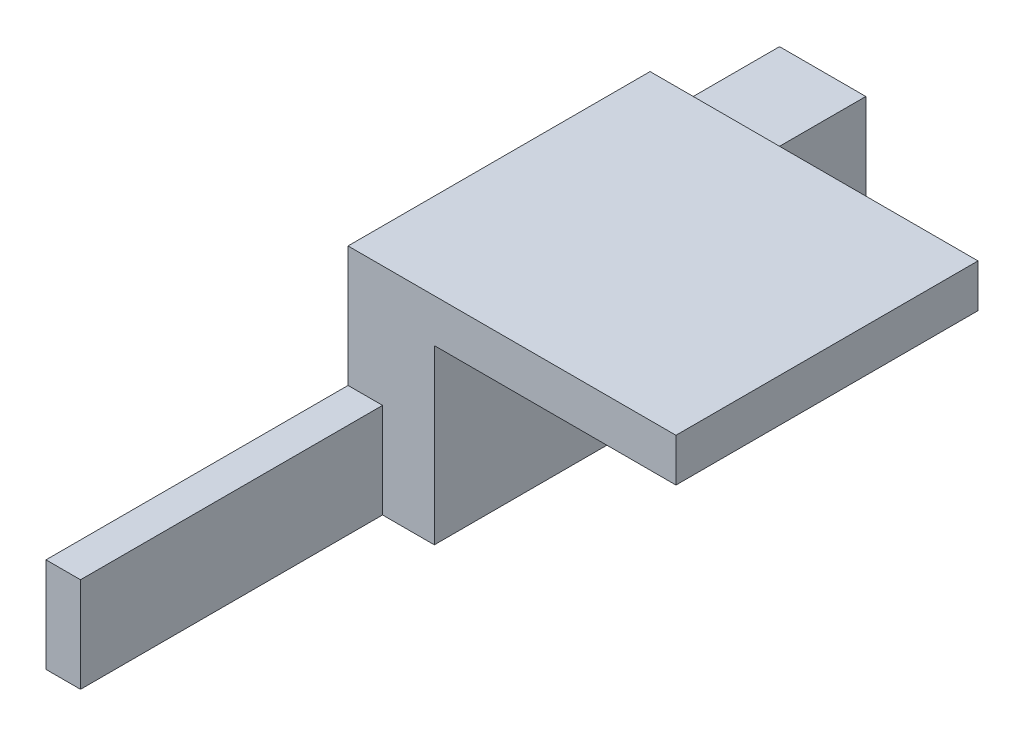
ISO-10303-21;
HEADER;
FILE_DESCRIPTION(('STEP AP214'),'2;1');
FILE_NAME('part.step','',(''),(''),'','','');
FILE_SCHEMA(('AUTOMOTIVE_DESIGN { 1 0 10303 214 1 1 1 1 }'));
ENDSEC;
DATA;
#1=APPLICATION_CONTEXT('core data for automotive mechanical design processes');
#2=APPLICATION_PROTOCOL_DEFINITION('international standard','automotive_design',2000,#1);
#3=PRODUCT_CONTEXT('',#1,'mechanical');
#4=PRODUCT('Part','Part','',(#3));
#5=PRODUCT_RELATED_PRODUCT_CATEGORY('part','',(#4));
#6=PRODUCT_DEFINITION_FORMATION('','',#4);
#7=PRODUCT_DEFINITION_CONTEXT('part definition',#1,'design');
#8=PRODUCT_DEFINITION('design','',#6,#7);
#9=PRODUCT_DEFINITION_SHAPE('','',#8);
#10=(LENGTH_UNIT() NAMED_UNIT(*) SI_UNIT(.MILLI.,.METRE.));
#11=(NAMED_UNIT(*) PLANE_ANGLE_UNIT() SI_UNIT($,.RADIAN.));
#12=(NAMED_UNIT(*) SI_UNIT($,.STERADIAN.) SOLID_ANGLE_UNIT());
#13=UNCERTAINTY_MEASURE_WITH_UNIT(LENGTH_MEASURE(1.E-05),#10,'distance_accuracy_value','');
#14=(GEOMETRIC_REPRESENTATION_CONTEXT(3) GLOBAL_UNCERTAINTY_ASSIGNED_CONTEXT((#13)) GLOBAL_UNIT_ASSIGNED_CONTEXT((#10,
#11,#12)) REPRESENTATION_CONTEXT('',''));
#15=CARTESIAN_POINT('',(0.,0.,0.));
#16=DIRECTION('',(0.,0.,1.));
#17=DIRECTION('',(1.,0.,0.));
#18=AXIS2_PLACEMENT_3D('',#15,#16,#17);
#19=CARTESIAN_POINT('',(0.,0.,0.));
#20=DIRECTION('',(0.,-1.,0.));
#21=DIRECTION('',(0.,0.,-1.));
#22=AXIS2_PLACEMENT_3D('',#19,#20,#21);
#23=PLANE('',#22);
#24=DIRECTION('',(-1.,0.,0.));
#25=VECTOR('',#24,1.);
#26=CARTESIAN_POINT('',(38.,0.,35.));
#27=LINE('',#26,#25);
#28=CARTESIAN_POINT('',(38.,0.,35.));
#29=VERTEX_POINT('',#28);
#30=CARTESIAN_POINT('',(10.,0.,35.));
#31=VERTEX_POINT('',#30);
#32=EDGE_CURVE('E189',#29,#31,#27,.T.);
#33=ORIENTED_EDGE('',*,*,#32,.T.);
#34=DIRECTION('',(0.,0.,-1.));
#35=VECTOR('',#34,1.);
#36=CARTESIAN_POINT('',(10.,0.,35.));
#37=LINE('',#36,#35);
#38=CARTESIAN_POINT('',(10.,0.,0.));
#39=VERTEX_POINT('',#38);
#40=EDGE_CURVE('E162',#31,#39,#37,.T.);
#41=ORIENTED_EDGE('',*,*,#40,.T.);
#42=DIRECTION('',(-1.,0.,0.));
#43=VECTOR('',#42,1.);
#44=CARTESIAN_POINT('',(38.,0.,0.));
#45=LINE('',#44,#43);
#46=CARTESIAN_POINT('',(38.,0.,0.));
#47=VERTEX_POINT('',#46);
#48=EDGE_CURVE('E180',#47,#39,#45,.T.);
#49=ORIENTED_EDGE('',*,*,#48,.F.);
#50=DIRECTION('',(0.,0.,1.));
#51=VECTOR('',#50,1.);
#52=CARTESIAN_POINT('',(38.,0.,0.));
#53=LINE('',#52,#51);
#54=EDGE_CURVE('E171',#47,#29,#53,.T.);
#55=ORIENTED_EDGE('',*,*,#54,.T.);
#56=EDGE_LOOP('',(#33,#41,#49,#55));
#57=FACE_BOUND('',#56,.T.);
#58=ADVANCED_FACE('F35',(#57),#23,.T.);
#59=CARTESIAN_POINT('',(38.,5.,0.));
#60=DIRECTION('',(1.,0.,0.));
#61=DIRECTION('',(0.,0.,-1.));
#62=AXIS2_PLACEMENT_3D('',#59,#60,#61);
#63=PLANE('',#62);
#64=ORIENTED_EDGE('',*,*,#54,.F.);
#65=DIRECTION('',(0.,-1.,0.));
#66=VECTOR('',#65,1.);
#67=CARTESIAN_POINT('',(38.,5.,0.));
#68=LINE('',#67,#66);
#69=CARTESIAN_POINT('',(38.,5.,0.));
#70=VERTEX_POINT('',#69);
#71=EDGE_CURVE('E11',#70,#47,#68,.T.);
#72=ORIENTED_EDGE('',*,*,#71,.F.);
#73=DIRECTION('',(0.,0.,1.));
#74=VECTOR('',#73,1.);
#75=CARTESIAN_POINT('',(38.,5.,0.));
#76=LINE('',#75,#74);
#77=CARTESIAN_POINT('',(38.,5.,35.));
#78=VERTEX_POINT('',#77);
#79=EDGE_CURVE('E176',#70,#78,#76,.T.);
#80=ORIENTED_EDGE('',*,*,#79,.T.);
#81=DIRECTION('',(0.,-1.,0.));
#82=VECTOR('',#81,1.);
#83=CARTESIAN_POINT('',(38.,5.,35.));
#84=LINE('',#83,#82);
#85=EDGE_CURVE('E39',#78,#29,#84,.T.);
#86=ORIENTED_EDGE('',*,*,#85,.T.);
#87=EDGE_LOOP('',(#64,#72,#80,#86));
#88=FACE_BOUND('',#87,.T.);
#89=ADVANCED_FACE('F37',(#88),#63,.T.);
#90=CARTESIAN_POINT('',(38.,5.,0.));
#91=DIRECTION('',(0.,0.,1.));
#92=DIRECTION('',(1.,0.,0.));
#93=AXIS2_PLACEMENT_3D('',#90,#91,#92);
#94=PLANE('',#93);
#95=ORIENTED_EDGE('',*,*,#48,.T.);
#96=CARTESIAN_POINT('',(0.,0.,0.));
#97=VERTEX_POINT('',#96);
#98=EDGE_CURVE('E192',#39,#97,#45,.T.);
#99=ORIENTED_EDGE('',*,*,#98,.T.);
#100=DIRECTION('',(0.,-1.,0.));
#101=VECTOR('',#100,1.);
#102=CARTESIAN_POINT('',(0.,5.,0.));
#103=LINE('',#102,#101);
#104=CARTESIAN_POINT('',(0.,5.,0.));
#105=VERTEX_POINT('',#104);
#106=EDGE_CURVE('E44',#105,#97,#103,.T.);
#107=ORIENTED_EDGE('',*,*,#106,.F.);
#108=DIRECTION('',(-1.,0.,0.));
#109=VECTOR('',#108,1.);
#110=CARTESIAN_POINT('',(38.,5.,0.));
#111=LINE('',#110,#109);
#112=EDGE_CURVE('E185',#70,#105,#111,.T.);
#113=ORIENTED_EDGE('',*,*,#112,.F.);
#114=ORIENTED_EDGE('',*,*,#71,.T.);
#115=EDGE_LOOP('',(#95,#99,#107,#113,#114));
#116=FACE_BOUND('',#115,.T.);
#117=ADVANCED_FACE('F211',(#116),#94,.F.);
#118=CARTESIAN_POINT('',(0.,5.,0.));
#119=DIRECTION('',(1.,0.,0.));
#120=DIRECTION('',(0.,0.,-1.));
#121=AXIS2_PLACEMENT_3D('',#118,#119,#120);
#122=PLANE('',#121);
#123=CARTESIAN_POINT('',(0.,-14.5,51.7000000000001));
#124=DIRECTION('',(1.,0.,0.));
#125=DIRECTION('',(0.,0.,-1.));
#126=AXIS2_PLACEMENT_3D('',#123,#124,#125);
#127=CIRCLE('',#126,3.09999999999999);
#128=CARTESIAN_POINT('',(0.,-14.5,48.6000000000001));
#129=VERTEX_POINT('',#128);
#130=EDGE_CURVE('E384',#129,#129,#127,.T.);
#131=ORIENTED_EDGE('',*,*,#130,.T.);
#132=EDGE_LOOP('',(#131));
#133=FACE_BOUND('',#132,.T.);
#134=CARTESIAN_POINT('',(0.,-14.5,29.4000000000001));
#135=DIRECTION('',(1.,0.,0.));
#136=DIRECTION('',(0.,0.,-1.));
#137=AXIS2_PLACEMENT_3D('',#134,#135,#136);
#138=CIRCLE('',#137,3.1);
#139=CARTESIAN_POINT('',(0.,-14.5,26.3000000000001));
#140=VERTEX_POINT('',#139);
#141=EDGE_CURVE('E387',#140,#140,#138,.T.);
#142=ORIENTED_EDGE('',*,*,#141,.T.);
#143=EDGE_LOOP('',(#142));
#144=FACE_BOUND('',#143,.T.);
#145=ORIENTED_EDGE('',*,*,#106,.T.);
#146=DIRECTION('',(0.,0.,-1.));
#147=VECTOR('',#146,1.);
#148=CARTESIAN_POINT('',(0.,0.,35.));
#149=LINE('',#148,#147);
#150=CARTESIAN_POINT('',(0.,0.,-15.));
#151=VERTEX_POINT('',#150);
#152=EDGE_CURVE('E155',#97,#151,#149,.T.);
#153=ORIENTED_EDGE('',*,*,#152,.T.);
#154=DIRECTION('',(0.,1.,0.));
#155=VECTOR('',#154,1.);
#156=CARTESIAN_POINT('',(0.,-20.,-15.));
#157=LINE('',#156,#155);
#158=CARTESIAN_POINT('',(0.,-20.,-15.));
#159=VERTEX_POINT('',#158);
#160=EDGE_CURVE('E172',#159,#151,#157,.T.);
#161=ORIENTED_EDGE('',*,*,#160,.F.);
#162=DIRECTION('',(0.,0.,-1.));
#163=VECTOR('',#162,1.);
#164=CARTESIAN_POINT('',(0.,-20.,35.));
#165=LINE('',#164,#163);
#166=CARTESIAN_POINT('',(0.,-20.,70.));
#167=VERTEX_POINT('',#166);
#168=EDGE_CURVE('E158',#167,#159,#165,.T.);
#169=ORIENTED_EDGE('',*,*,#168,.F.);
#170=DIRECTION('',(0.,-1.,0.));
#171=VECTOR('',#170,1.);
#172=CARTESIAN_POINT('',(0.,5.,70.));
#173=LINE('',#172,#171);
#174=CARTESIAN_POINT('',(0.,-8.99999999999997,70.));
#175=VERTEX_POINT('',#174);
#176=EDGE_CURVE('E130',#175,#167,#173,.T.);
#177=ORIENTED_EDGE('',*,*,#176,.F.);
#178=DIRECTION('',(0.,0.,1.));
#179=VECTOR('',#178,1.);
#180=CARTESIAN_POINT('',(0.,-8.99999999999996,0.));
#181=LINE('',#180,#179);
#182=CARTESIAN_POINT('',(0.,-8.99999999999996,35.));
#183=VERTEX_POINT('',#182);
#184=EDGE_CURVE('E123',#183,#175,#181,.T.);
#185=ORIENTED_EDGE('',*,*,#184,.F.);
#186=DIRECTION('',(0.,-1.,0.));
#187=VECTOR('',#186,1.);
#188=CARTESIAN_POINT('',(0.,5.,35.));
#189=LINE('',#188,#187);
#190=CARTESIAN_POINT('',(0.,5.,35.));
#191=VERTEX_POINT('',#190);
#192=EDGE_CURVE('E196',#191,#183,#189,.T.);
#193=ORIENTED_EDGE('',*,*,#192,.F.);
#194=DIRECTION('',(0.,0.,1.));
#195=VECTOR('',#194,1.);
#196=CARTESIAN_POINT('',(0.,5.,0.));
#197=LINE('',#196,#195);
#198=EDGE_CURVE('E183',#105,#191,#197,.T.);
#199=ORIENTED_EDGE('',*,*,#198,.F.);
#200=EDGE_LOOP('',(#145,#153,#161,#169,#177,#185,#193,#199));
#201=FACE_BOUND('',#200,.T.);
#202=ADVANCED_FACE('F219',(#133,#144,#201),#122,.F.);
#203=CARTESIAN_POINT('',(38.,5.,35.));
#204=DIRECTION('',(0.,0.,1.));
#205=DIRECTION('',(1.,0.,0.));
#206=AXIS2_PLACEMENT_3D('',#203,#204,#205);
#207=PLANE('',#206);
#208=DIRECTION('',(-1.,0.,0.));
#209=VECTOR('',#208,1.);
#210=CARTESIAN_POINT('',(4.,-8.99999999999996,35.));
#211=LINE('',#210,#209);
#212=CARTESIAN_POINT('',(4.,-8.99999999999996,35.));
#213=VERTEX_POINT('',#212);
#214=EDGE_CURVE('E132',#213,#183,#211,.T.);
#215=ORIENTED_EDGE('',*,*,#214,.F.);
#216=DIRECTION('',(0.,-1.,0.));
#217=VECTOR('',#216,1.);
#218=CARTESIAN_POINT('',(4.,5.,35.));
#219=LINE('',#218,#217);
#220=CARTESIAN_POINT('',(4.,-20.,35.));
#221=VERTEX_POINT('',#220);
#222=EDGE_CURVE('E139',#213,#221,#219,.T.);
#223=ORIENTED_EDGE('',*,*,#222,.T.);
#224=DIRECTION('',(-1.,0.,0.));
#225=VECTOR('',#224,1.);
#226=CARTESIAN_POINT('',(10.,-20.,35.));
#227=LINE('',#226,#225);
#228=CARTESIAN_POINT('',(10.,-20.,35.));
#229=VERTEX_POINT('',#228);
#230=EDGE_CURVE('E138',#229,#221,#227,.T.);
#231=ORIENTED_EDGE('',*,*,#230,.F.);
#232=DIRECTION('',(0.,1.,0.));
#233=VECTOR('',#232,1.);
#234=CARTESIAN_POINT('',(10.,-20.,35.));
#235=LINE('',#234,#233);
#236=EDGE_CURVE('E169',#229,#31,#235,.T.);
#237=ORIENTED_EDGE('',*,*,#236,.T.);
#238=ORIENTED_EDGE('',*,*,#32,.F.);
#239=ORIENTED_EDGE('',*,*,#85,.F.);
#240=DIRECTION('',(-1.,0.,0.));
#241=VECTOR('',#240,1.);
#242=CARTESIAN_POINT('',(38.,5.,35.));
#243=LINE('',#242,#241);
#244=EDGE_CURVE('E179',#78,#191,#243,.T.);
#245=ORIENTED_EDGE('',*,*,#244,.T.);
#246=ORIENTED_EDGE('',*,*,#192,.T.);
#247=EDGE_LOOP('',(#215,#223,#231,#237,#238,#239,#245,#246));
#248=FACE_BOUND('',#247,.T.);
#249=ADVANCED_FACE('F206',(#248),#207,.T.);
#250=CARTESIAN_POINT('',(0.,5.,0.));
#251=DIRECTION('',(0.,-1.,0.));
#252=DIRECTION('',(0.,0.,-1.));
#253=AXIS2_PLACEMENT_3D('',#250,#251,#252);
#254=PLANE('',#253);
#255=ORIENTED_EDGE('',*,*,#79,.F.);
#256=ORIENTED_EDGE('',*,*,#112,.T.);
#257=ORIENTED_EDGE('',*,*,#198,.T.);
#258=ORIENTED_EDGE('',*,*,#244,.F.);
#259=EDGE_LOOP('',(#255,#256,#257,#258));
#260=FACE_BOUND('',#259,.T.);
#261=ADVANCED_FACE('F216',(#260),#254,.F.);
#262=CARTESIAN_POINT('',(0.,0.,0.));
#263=DIRECTION('',(0.,1.,0.));
#264=DIRECTION('',(0.,0.,1.));
#265=AXIS2_PLACEMENT_3D('',#262,#263,#264);
#266=PLANE('',#265);
#267=ORIENTED_EDGE('',*,*,#98,.F.);
#268=CARTESIAN_POINT('',(10.,0.,-15.));
#269=VERTEX_POINT('',#268);
#270=EDGE_CURVE('E60',#39,#269,#37,.T.);
#271=ORIENTED_EDGE('',*,*,#270,.T.);
#272=DIRECTION('',(-1.,0.,0.));
#273=VECTOR('',#272,1.);
#274=CARTESIAN_POINT('',(10.,0.,-15.));
#275=LINE('',#274,#273);
#276=EDGE_CURVE('E165',#269,#151,#275,.T.);
#277=ORIENTED_EDGE('',*,*,#276,.T.);
#278=ORIENTED_EDGE('',*,*,#152,.F.);
#279=EDGE_LOOP('',(#267,#271,#277,#278));
#280=FACE_BOUND('',#279,.T.);
#281=ADVANCED_FACE('F229',(#280),#266,.T.);
#282=CARTESIAN_POINT('',(10.,-20.,35.));
#283=DIRECTION('',(1.,0.,0.));
#284=DIRECTION('',(0.,0.,-1.));
#285=AXIS2_PLACEMENT_3D('',#282,#283,#284);
#286=PLANE('',#285);
#287=ORIENTED_EDGE('',*,*,#40,.F.);
#288=ORIENTED_EDGE('',*,*,#236,.F.);
#289=DIRECTION('',(0.,0.,-1.));
#290=VECTOR('',#289,1.);
#291=CARTESIAN_POINT('',(10.,-20.,35.));
#292=LINE('',#291,#290);
#293=CARTESIAN_POINT('',(10.,-20.,-15.));
#294=VERTEX_POINT('',#293);
#295=EDGE_CURVE('E151',#229,#294,#292,.T.);
#296=ORIENTED_EDGE('',*,*,#295,.T.);
#297=DIRECTION('',(0.,1.,0.));
#298=VECTOR('',#297,1.);
#299=CARTESIAN_POINT('',(10.,-20.,-15.));
#300=LINE('',#299,#298);
#301=EDGE_CURVE('E161',#294,#269,#300,.T.);
#302=ORIENTED_EDGE('',*,*,#301,.T.);
#303=ORIENTED_EDGE('',*,*,#270,.F.);
#304=EDGE_LOOP('',(#287,#288,#296,#302,#303));
#305=FACE_BOUND('',#304,.T.);
#306=ADVANCED_FACE('F223',(#305),#286,.T.);
#307=CARTESIAN_POINT('',(10.,-20.,-15.));
#308=DIRECTION('',(0.,0.,-1.));
#309=DIRECTION('',(-1.,0.,0.));
#310=AXIS2_PLACEMENT_3D('',#307,#308,#309);
#311=PLANE('',#310);
#312=ORIENTED_EDGE('',*,*,#276,.F.);
#313=ORIENTED_EDGE('',*,*,#301,.F.);
#314=DIRECTION('',(-1.,0.,0.));
#315=VECTOR('',#314,1.);
#316=CARTESIAN_POINT('',(10.,-20.,-15.));
#317=LINE('',#316,#315);
#318=EDGE_CURVE('E154',#294,#159,#317,.T.);
#319=ORIENTED_EDGE('',*,*,#318,.T.);
#320=ORIENTED_EDGE('',*,*,#160,.T.);
#321=EDGE_LOOP('',(#312,#313,#319,#320));
#322=FACE_BOUND('',#321,.T.);
#323=ADVANCED_FACE('F226',(#322),#311,.T.);
#324=CARTESIAN_POINT('',(0.,-20.,0.));
#325=DIRECTION('',(0.,1.,0.));
#326=DIRECTION('',(0.,0.,1.));
#327=AXIS2_PLACEMENT_3D('',#324,#325,#326);
#328=PLANE('',#327);
#329=ORIENTED_EDGE('',*,*,#295,.F.);
#330=ORIENTED_EDGE('',*,*,#230,.T.);
#331=DIRECTION('',(0.,0.,1.));
#332=VECTOR('',#331,1.);
#333=CARTESIAN_POINT('',(4.,-20.,0.));
#334=LINE('',#333,#332);
#335=CARTESIAN_POINT('',(4.00000000000001,-20.,70.));
#336=VERTEX_POINT('',#335);
#337=EDGE_CURVE('E52',#221,#336,#334,.T.);
#338=ORIENTED_EDGE('',*,*,#337,.T.);
#339=DIRECTION('',(-1.,0.,0.));
#340=VECTOR('',#339,1.);
#341=CARTESIAN_POINT('',(4.00000000000001,-20.,70.));
#342=LINE('',#341,#340);
#343=EDGE_CURVE('E127',#336,#167,#342,.T.);
#344=ORIENTED_EDGE('',*,*,#343,.T.);
#345=ORIENTED_EDGE('',*,*,#168,.T.);
#346=ORIENTED_EDGE('',*,*,#318,.F.);
#347=EDGE_LOOP('',(#329,#330,#338,#344,#345,#346));
#348=FACE_BOUND('',#347,.T.);
#349=ADVANCED_FACE('F136',(#348),#328,.F.);
#350=CARTESIAN_POINT('',(4.00000000000001,5.,70.));
#351=DIRECTION('',(0.,0.,-1.));
#352=DIRECTION('',(-1.,0.,0.));
#353=AXIS2_PLACEMENT_3D('',#350,#351,#352);
#354=PLANE('',#353);
#355=ORIENTED_EDGE('',*,*,#176,.T.);
#356=ORIENTED_EDGE('',*,*,#343,.F.);
#357=DIRECTION('',(0.,-1.,0.));
#358=VECTOR('',#357,1.);
#359=CARTESIAN_POINT('',(4.00000000000001,5.,70.));
#360=LINE('',#359,#358);
#361=CARTESIAN_POINT('',(4.00000000000001,-8.99999999999997,70.));
#362=VERTEX_POINT('',#361);
#363=EDGE_CURVE('E116',#362,#336,#360,.T.);
#364=ORIENTED_EDGE('',*,*,#363,.F.);
#365=DIRECTION('',(-1.,0.,0.));
#366=VECTOR('',#365,1.);
#367=CARTESIAN_POINT('',(4.00000000000001,-8.99999999999997,70.));
#368=LINE('',#367,#366);
#369=EDGE_CURVE('E145',#362,#175,#368,.T.);
#370=ORIENTED_EDGE('',*,*,#369,.T.);
#371=EDGE_LOOP('',(#355,#356,#364,#370));
#372=FACE_BOUND('',#371,.T.);
#373=ADVANCED_FACE('F128',(#372),#354,.F.);
#374=CARTESIAN_POINT('',(4.,-8.99999999999996,0.));
#375=DIRECTION('',(0.,-1.,0.));
#376=DIRECTION('',(0.,0.,-1.));
#377=AXIS2_PLACEMENT_3D('',#374,#375,#376);
#378=PLANE('',#377);
#379=ORIENTED_EDGE('',*,*,#184,.T.);
#380=ORIENTED_EDGE('',*,*,#369,.F.);
#381=DIRECTION('',(0.,0.,1.));
#382=VECTOR('',#381,1.);
#383=CARTESIAN_POINT('',(4.,-8.99999999999996,0.));
#384=LINE('',#383,#382);
#385=EDGE_CURVE('E119',#213,#362,#384,.T.);
#386=ORIENTED_EDGE('',*,*,#385,.F.);
#387=ORIENTED_EDGE('',*,*,#214,.T.);
#388=EDGE_LOOP('',(#379,#380,#386,#387));
#389=FACE_BOUND('',#388,.T.);
#390=ADVANCED_FACE('F221',(#389),#378,.F.);
#391=CARTESIAN_POINT('',(4.,0.,0.));
#392=DIRECTION('',(-1.,0.,0.));
#393=DIRECTION('',(0.,0.,1.));
#394=AXIS2_PLACEMENT_3D('',#391,#392,#393);
#395=PLANE('',#394);
#396=ORIENTED_EDGE('',*,*,#363,.T.);
#397=ORIENTED_EDGE('',*,*,#337,.F.);
#398=ORIENTED_EDGE('',*,*,#222,.F.);
#399=ORIENTED_EDGE('',*,*,#385,.T.);
#400=EDGE_LOOP('',(#396,#397,#398,#399));
#401=FACE_BOUND('',#400,.T.);
#402=ADVANCED_FACE('F118',(#401),#395,.F.);
#403=CARTESIAN_POINT('',(3.,-14.5,29.4000000000001));
#404=DIRECTION('',(-1.,0.,0.));
#405=DIRECTION('',(0.,0.,1.));
#406=AXIS2_PLACEMENT_3D('',#403,#404,#405);
#407=CYLINDRICAL_SURFACE('',#406,3.1);
#408=CARTESIAN_POINT('',(3.,-14.5,29.4000000000001));
#409=DIRECTION('',(1.,0.,0.));
#410=DIRECTION('',(0.,0.,-1.));
#411=AXIS2_PLACEMENT_3D('',#408,#409,#410);
#412=CIRCLE('',#411,3.1);
#413=CARTESIAN_POINT('',(3.,-14.5,26.3000000000001));
#414=VERTEX_POINT('',#413);
#415=EDGE_CURVE('E391',#414,#414,#412,.T.);
#416=ORIENTED_EDGE('',*,*,#415,.T.);
#417=EDGE_LOOP('',(#416));
#418=FACE_BOUND('',#417,.T.);
#419=ORIENTED_EDGE('',*,*,#141,.F.);
#420=EDGE_LOOP('',(#419));
#421=FACE_BOUND('',#420,.T.);
#422=ADVANCED_FACE('F318',(#418,#421),#407,.F.);
#423=CARTESIAN_POINT('',(3.,-14.5,29.4000000000001));
#424=DIRECTION('',(1.,0.,0.));
#425=DIRECTION('',(0.,0.,-1.));
#426=AXIS2_PLACEMENT_3D('',#423,#424,#425);
#427=PLANE('',#426);
#428=ORIENTED_EDGE('',*,*,#415,.F.);
#429=EDGE_LOOP('',(#428));
#430=FACE_BOUND('',#429,.T.);
#431=ADVANCED_FACE('F325',(#430),#427,.F.);
#432=CARTESIAN_POINT('',(3.00000000000001,-14.5,51.7000000000001));
#433=DIRECTION('',(-1.,0.,0.));
#434=DIRECTION('',(0.,0.,1.));
#435=AXIS2_PLACEMENT_3D('',#432,#433,#434);
#436=CYLINDRICAL_SURFACE('',#435,3.09999999999999);
#437=CARTESIAN_POINT('',(3.00000000000001,-14.5,51.7000000000001));
#438=DIRECTION('',(1.,0.,0.));
#439=DIRECTION('',(0.,0.,-1.));
#440=AXIS2_PLACEMENT_3D('',#437,#438,#439);
#441=CIRCLE('',#440,3.09999999999999);
#442=CARTESIAN_POINT('',(3.00000000000001,-14.5,48.6000000000001));
#443=VERTEX_POINT('',#442);
#444=EDGE_CURVE('E147',#443,#443,#441,.T.);
#445=ORIENTED_EDGE('',*,*,#444,.T.);
#446=EDGE_LOOP('',(#445));
#447=FACE_BOUND('',#446,.T.);
#448=ORIENTED_EDGE('',*,*,#130,.F.);
#449=EDGE_LOOP('',(#448));
#450=FACE_BOUND('',#449,.T.);
#451=ADVANCED_FACE('F333',(#447,#450),#436,.F.);
#452=CARTESIAN_POINT('',(3.00000000000001,-14.5,51.7000000000001));
#453=DIRECTION('',(1.,0.,0.));
#454=DIRECTION('',(0.,0.,-1.));
#455=AXIS2_PLACEMENT_3D('',#452,#453,#454);
#456=PLANE('',#455);
#457=ORIENTED_EDGE('',*,*,#444,.F.);
#458=EDGE_LOOP('',(#457));
#459=FACE_BOUND('',#458,.T.);
#460=ADVANCED_FACE('F341',(#459),#456,.F.);
#461=CLOSED_SHELL('',(#58,#89,#117,#202,#249,#261,#281,#306,#323,#349,#373,#390,#402,#422,#431,
#451,#460));
#462=MANIFOLD_SOLID_BREP('B2',#461);
#463=ADVANCED_BREP_SHAPE_REPRESENTATION('',(#18,#462),#14);
#464=SHAPE_DEFINITION_REPRESENTATION(#9,#463);
ENDSEC;
END-ISO-10303-21;
